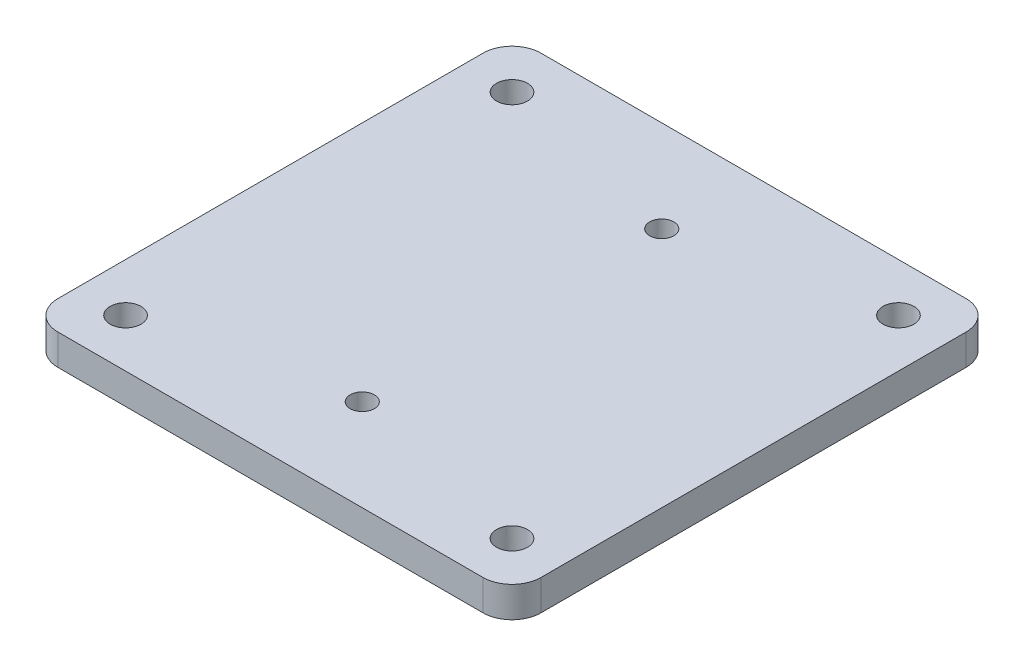
ISO-10303-21;
HEADER;
FILE_DESCRIPTION(('STEP AP214'),'2;1');
FILE_NAME('part.step','',(''),(''),'','','');
FILE_SCHEMA(('AUTOMOTIVE_DESIGN { 1 0 10303 214 1 1 1 1 }'));
ENDSEC;
DATA;
#1=APPLICATION_CONTEXT('core data for automotive mechanical design processes');
#2=APPLICATION_PROTOCOL_DEFINITION('international standard','automotive_design',2000,#1);
#3=PRODUCT_CONTEXT('',#1,'mechanical');
#4=PRODUCT('Part','Part','',(#3));
#5=PRODUCT_RELATED_PRODUCT_CATEGORY('part','',(#4));
#6=PRODUCT_DEFINITION_FORMATION('','',#4);
#7=PRODUCT_DEFINITION_CONTEXT('part definition',#1,'design');
#8=PRODUCT_DEFINITION('design','',#6,#7);
#9=PRODUCT_DEFINITION_SHAPE('','',#8);
#10=(LENGTH_UNIT() NAMED_UNIT(*) SI_UNIT(.MILLI.,.METRE.));
#11=(NAMED_UNIT(*) PLANE_ANGLE_UNIT() SI_UNIT($,.RADIAN.));
#12=(NAMED_UNIT(*) SI_UNIT($,.STERADIAN.) SOLID_ANGLE_UNIT());
#13=UNCERTAINTY_MEASURE_WITH_UNIT(LENGTH_MEASURE(1.E-05),#10,'distance_accuracy_value','');
#14=(GEOMETRIC_REPRESENTATION_CONTEXT(3) GLOBAL_UNCERTAINTY_ASSIGNED_CONTEXT((#13)) GLOBAL_UNIT_ASSIGNED_CONTEXT((#10,
#11,#12)) REPRESENTATION_CONTEXT('',''));
#15=CARTESIAN_POINT('',(0.,0.,0.));
#16=DIRECTION('',(0.,0.,1.));
#17=DIRECTION('',(1.,0.,0.));
#18=AXIS2_PLACEMENT_3D('',#15,#16,#17);
#19=CARTESIAN_POINT('',(0.,0.,0.));
#20=DIRECTION('',(0.,-1.,0.));
#21=DIRECTION('',(0.,0.,-1.));
#22=AXIS2_PLACEMENT_3D('',#19,#20,#21);
#23=PLANE('',#22);
#24=DIRECTION('',(0.,0.,-1.));
#25=VECTOR('',#24,1.);
#26=CARTESIAN_POINT('',(25.,0.,25.));
#27=LINE('',#26,#25);
#28=CARTESIAN_POINT('',(25.,0.,22.));
#29=VERTEX_POINT('',#28);
#30=CARTESIAN_POINT('',(25.,0.,-22.));
#31=VERTEX_POINT('',#30);
#32=EDGE_CURVE('E123',#29,#31,#27,.T.);
#33=ORIENTED_EDGE('',*,*,#32,.F.);
#34=CARTESIAN_POINT('',(22.,0.,22.));
#35=DIRECTION('',(0.,-1.,0.));
#36=DIRECTION('',(0.,0.,-1.));
#37=AXIS2_PLACEMENT_3D('',#34,#35,#36);
#38=CIRCLE('',#37,3.);
#39=CARTESIAN_POINT('',(22.,0.,25.));
#40=VERTEX_POINT('',#39);
#41=EDGE_CURVE('E106',#29,#40,#38,.T.);
#42=ORIENTED_EDGE('',*,*,#41,.T.);
#43=DIRECTION('',(1.,0.,0.));
#44=VECTOR('',#43,1.);
#45=CARTESIAN_POINT('',(-25.,0.,25.));
#46=LINE('',#45,#44);
#47=CARTESIAN_POINT('',(-22.,0.,25.));
#48=VERTEX_POINT('',#47);
#49=EDGE_CURVE('E147',#48,#40,#46,.T.);
#50=ORIENTED_EDGE('',*,*,#49,.F.);
#51=CARTESIAN_POINT('',(-22.,0.,22.));
#52=DIRECTION('',(0.,-1.,0.));
#53=DIRECTION('',(0.,0.,-1.));
#54=AXIS2_PLACEMENT_3D('',#51,#52,#53);
#55=CIRCLE('',#54,3.);
#56=CARTESIAN_POINT('',(-25.,0.,22.));
#57=VERTEX_POINT('',#56);
#58=EDGE_CURVE('E117',#48,#57,#55,.T.);
#59=ORIENTED_EDGE('',*,*,#58,.T.);
#60=DIRECTION('',(0.,0.,1.));
#61=VECTOR('',#60,1.);
#62=CARTESIAN_POINT('',(-25.,0.,25.));
#63=LINE('',#62,#61);
#64=CARTESIAN_POINT('',(-25.,0.,-22.));
#65=VERTEX_POINT('',#64);
#66=EDGE_CURVE('E137',#65,#57,#63,.T.);
#67=ORIENTED_EDGE('',*,*,#66,.F.);
#68=CARTESIAN_POINT('',(-22.,0.,-22.));
#69=DIRECTION('',(0.,-1.,0.));
#70=DIRECTION('',(0.,0.,-1.));
#71=AXIS2_PLACEMENT_3D('',#68,#69,#70);
#72=CIRCLE('',#71,3.);
#73=CARTESIAN_POINT('',(-22.,0.,-25.));
#74=VERTEX_POINT('',#73);
#75=EDGE_CURVE('E127',#65,#74,#72,.T.);
#76=ORIENTED_EDGE('',*,*,#75,.T.);
#77=DIRECTION('',(-1.,0.,0.));
#78=VECTOR('',#77,1.);
#79=CARTESIAN_POINT('',(-25.,0.,-25.));
#80=LINE('',#79,#78);
#81=CARTESIAN_POINT('',(22.,0.,-25.));
#82=VERTEX_POINT('',#81);
#83=EDGE_CURVE('E133',#82,#74,#80,.T.);
#84=ORIENTED_EDGE('',*,*,#83,.F.);
#85=CARTESIAN_POINT('',(22.,0.,-22.));
#86=DIRECTION('',(0.,-1.,0.));
#87=DIRECTION('',(0.,0.,-1.));
#88=AXIS2_PLACEMENT_3D('',#85,#86,#87);
#89=CIRCLE('',#88,3.);
#90=EDGE_CURVE('E132',#82,#31,#89,.T.);
#91=ORIENTED_EDGE('',*,*,#90,.T.);
#92=EDGE_LOOP('',(#33,#42,#50,#59,#67,#76,#84,#91));
#93=FACE_BOUND('',#92,.T.);
#94=CARTESIAN_POINT('',(20.,0.,20.));
#95=DIRECTION('',(0.,-1.,0.));
#96=DIRECTION('',(0.,0.,-1.));
#97=AXIS2_PLACEMENT_3D('',#94,#95,#96);
#98=CIRCLE('',#97,1.6);
#99=CARTESIAN_POINT('',(20.,0.,18.4));
#100=VERTEX_POINT('',#99);
#101=EDGE_CURVE('E134',#100,#100,#98,.T.);
#102=ORIENTED_EDGE('',*,*,#101,.F.);
#103=EDGE_LOOP('',(#102));
#104=FACE_BOUND('',#103,.T.);
#105=CARTESIAN_POINT('',(-20.,0.,20.));
#106=DIRECTION('',(0.,-1.,0.));
#107=DIRECTION('',(0.,0.,-1.));
#108=AXIS2_PLACEMENT_3D('',#105,#106,#107);
#109=CIRCLE('',#108,1.6);
#110=CARTESIAN_POINT('',(-20.,0.,18.4));
#111=VERTEX_POINT('',#110);
#112=EDGE_CURVE('E149',#111,#111,#109,.T.);
#113=ORIENTED_EDGE('',*,*,#112,.F.);
#114=EDGE_LOOP('',(#113));
#115=FACE_BOUND('',#114,.T.);
#116=CARTESIAN_POINT('',(20.,0.,-20.));
#117=DIRECTION('',(0.,-1.,0.));
#118=DIRECTION('',(0.,0.,-1.));
#119=AXIS2_PLACEMENT_3D('',#116,#117,#118);
#120=CIRCLE('',#119,1.6);
#121=CARTESIAN_POINT('',(20.,0.,-21.6));
#122=VERTEX_POINT('',#121);
#123=EDGE_CURVE('E203',#122,#122,#120,.T.);
#124=ORIENTED_EDGE('',*,*,#123,.F.);
#125=EDGE_LOOP('',(#124));
#126=FACE_BOUND('',#125,.T.);
#127=CARTESIAN_POINT('',(-20.,0.,-20.));
#128=DIRECTION('',(0.,-1.,0.));
#129=DIRECTION('',(0.,0.,-1.));
#130=AXIS2_PLACEMENT_3D('',#127,#128,#129);
#131=CIRCLE('',#130,1.6);
#132=CARTESIAN_POINT('',(-20.,0.,-21.6));
#133=VERTEX_POINT('',#132);
#134=EDGE_CURVE('E153',#133,#133,#131,.T.);
#135=ORIENTED_EDGE('',*,*,#134,.F.);
#136=EDGE_LOOP('',(#135));
#137=FACE_BOUND('',#136,.T.);
#138=CARTESIAN_POINT('',(0.,0.,15.5));
#139=DIRECTION('',(0.,1.,0.));
#140=DIRECTION('',(0.,0.,1.));
#141=AXIS2_PLACEMENT_3D('',#138,#139,#140);
#142=CIRCLE('',#141,1.25);
#143=CARTESIAN_POINT('',(0.,0.,16.75));
#144=VERTEX_POINT('',#143);
#145=EDGE_CURVE('E210',#144,#144,#142,.T.);
#146=ORIENTED_EDGE('',*,*,#145,.T.);
#147=EDGE_LOOP('',(#146));
#148=FACE_BOUND('',#147,.T.);
#149=CARTESIAN_POINT('',(0.,0.,-15.5));
#150=DIRECTION('',(0.,1.,0.));
#151=DIRECTION('',(0.,0.,1.));
#152=AXIS2_PLACEMENT_3D('',#149,#150,#151);
#153=CIRCLE('',#152,1.25);
#154=CARTESIAN_POINT('',(0.,0.,-14.25));
#155=VERTEX_POINT('',#154);
#156=EDGE_CURVE('E216',#155,#155,#153,.T.);
#157=ORIENTED_EDGE('',*,*,#156,.T.);
#158=EDGE_LOOP('',(#157));
#159=FACE_BOUND('',#158,.T.);
#160=ADVANCED_FACE('F39',(#93,#104,#115,#126,#137,#148,#159),#23,.T.);
#161=CARTESIAN_POINT('',(25.,3.175,25.));
#162=DIRECTION('',(-1.,0.,0.));
#163=DIRECTION('',(0.,0.,1.));
#164=AXIS2_PLACEMENT_3D('',#161,#162,#163);
#165=PLANE('',#164);
#166=DIRECTION('',(0.,0.,-1.));
#167=VECTOR('',#166,1.);
#168=CARTESIAN_POINT('',(25.,3.175,25.));
#169=LINE('',#168,#167);
#170=CARTESIAN_POINT('',(25.,3.175,22.));
#171=VERTEX_POINT('',#170);
#172=CARTESIAN_POINT('',(25.,3.175,-22.));
#173=VERTEX_POINT('',#172);
#174=EDGE_CURVE('E126',#171,#173,#169,.T.);
#175=ORIENTED_EDGE('',*,*,#174,.F.);
#176=DIRECTION('',(0.,-1.,0.));
#177=VECTOR('',#176,1.);
#178=CARTESIAN_POINT('',(25.,3.175,22.));
#179=LINE('',#178,#177);
#180=EDGE_CURVE('E110',#171,#29,#179,.T.);
#181=ORIENTED_EDGE('',*,*,#180,.T.);
#182=ORIENTED_EDGE('',*,*,#32,.T.);
#183=DIRECTION('',(0.,-1.,0.));
#184=VECTOR('',#183,1.);
#185=CARTESIAN_POINT('',(25.,3.175,-22.));
#186=LINE('',#185,#184);
#187=EDGE_CURVE('E128',#31,#173,#186,.F.);
#188=ORIENTED_EDGE('',*,*,#187,.T.);
#189=EDGE_LOOP('',(#175,#181,#182,#188));
#190=FACE_BOUND('',#189,.T.);
#191=ADVANCED_FACE('F122',(#190),#165,.F.);
#192=CARTESIAN_POINT('',(-25.,3.175,-25.));
#193=DIRECTION('',(0.,0.,1.));
#194=DIRECTION('',(1.,0.,0.));
#195=AXIS2_PLACEMENT_3D('',#192,#193,#194);
#196=PLANE('',#195);
#197=DIRECTION('',(-1.,0.,0.));
#198=VECTOR('',#197,1.);
#199=CARTESIAN_POINT('',(-25.,3.175,-25.));
#200=LINE('',#199,#198);
#201=CARTESIAN_POINT('',(22.,3.175,-25.));
#202=VERTEX_POINT('',#201);
#203=CARTESIAN_POINT('',(-22.,3.175,-25.));
#204=VERTEX_POINT('',#203);
#205=EDGE_CURVE('E179',#202,#204,#200,.T.);
#206=ORIENTED_EDGE('',*,*,#205,.F.);
#207=DIRECTION('',(0.,-1.,0.));
#208=VECTOR('',#207,1.);
#209=CARTESIAN_POINT('',(22.,3.175,-25.));
#210=LINE('',#209,#208);
#211=EDGE_CURVE('E11',#202,#82,#210,.T.);
#212=ORIENTED_EDGE('',*,*,#211,.T.);
#213=ORIENTED_EDGE('',*,*,#83,.T.);
#214=DIRECTION('',(0.,-1.,0.));
#215=VECTOR('',#214,1.);
#216=CARTESIAN_POINT('',(-22.,3.175,-25.));
#217=LINE('',#216,#215);
#218=EDGE_CURVE('E47',#74,#204,#217,.F.);
#219=ORIENTED_EDGE('',*,*,#218,.T.);
#220=EDGE_LOOP('',(#206,#212,#213,#219));
#221=FACE_BOUND('',#220,.T.);
#222=ADVANCED_FACE('F178',(#221),#196,.F.);
#223=CARTESIAN_POINT('',(-25.,3.175,25.));
#224=DIRECTION('',(1.,0.,0.));
#225=DIRECTION('',(0.,0.,-1.));
#226=AXIS2_PLACEMENT_3D('',#223,#224,#225);
#227=PLANE('',#226);
#228=ORIENTED_EDGE('',*,*,#66,.T.);
#229=DIRECTION('',(0.,-1.,0.));
#230=VECTOR('',#229,1.);
#231=CARTESIAN_POINT('',(-25.,3.175,22.));
#232=LINE('',#231,#230);
#233=CARTESIAN_POINT('',(-25.,3.175,22.));
#234=VERTEX_POINT('',#233);
#235=EDGE_CURVE('E54',#57,#234,#232,.F.);
#236=ORIENTED_EDGE('',*,*,#235,.T.);
#237=DIRECTION('',(0.,0.,1.));
#238=VECTOR('',#237,1.);
#239=CARTESIAN_POINT('',(-25.,3.175,25.));
#240=LINE('',#239,#238);
#241=CARTESIAN_POINT('',(-25.,3.175,-22.));
#242=VERTEX_POINT('',#241);
#243=EDGE_CURVE('E185',#242,#234,#240,.T.);
#244=ORIENTED_EDGE('',*,*,#243,.F.);
#245=DIRECTION('',(0.,-1.,0.));
#246=VECTOR('',#245,1.);
#247=CARTESIAN_POINT('',(-25.,3.175,-22.));
#248=LINE('',#247,#246);
#249=EDGE_CURVE('E172',#242,#65,#248,.T.);
#250=ORIENTED_EDGE('',*,*,#249,.T.);
#251=EDGE_LOOP('',(#228,#236,#244,#250));
#252=FACE_BOUND('',#251,.T.);
#253=ADVANCED_FACE('F189',(#252),#227,.F.);
#254=CARTESIAN_POINT('',(-25.,3.175,25.));
#255=DIRECTION('',(0.,0.,-1.));
#256=DIRECTION('',(-1.,0.,0.));
#257=AXIS2_PLACEMENT_3D('',#254,#255,#256);
#258=PLANE('',#257);
#259=ORIENTED_EDGE('',*,*,#49,.T.);
#260=DIRECTION('',(0.,-1.,0.));
#261=VECTOR('',#260,1.);
#262=CARTESIAN_POINT('',(22.,3.175,25.));
#263=LINE('',#262,#261);
#264=CARTESIAN_POINT('',(22.,3.175,25.));
#265=VERTEX_POINT('',#264);
#266=EDGE_CURVE('E111',#40,#265,#263,.F.);
#267=ORIENTED_EDGE('',*,*,#266,.T.);
#268=DIRECTION('',(1.,0.,0.));
#269=VECTOR('',#268,1.);
#270=CARTESIAN_POINT('',(-25.,3.175,25.));
#271=LINE('',#270,#269);
#272=CARTESIAN_POINT('',(-22.,3.175,25.));
#273=VERTEX_POINT('',#272);
#274=EDGE_CURVE('E143',#273,#265,#271,.T.);
#275=ORIENTED_EDGE('',*,*,#274,.F.);
#276=DIRECTION('',(0.,-1.,0.));
#277=VECTOR('',#276,1.);
#278=CARTESIAN_POINT('',(-22.,3.175,25.));
#279=LINE('',#278,#277);
#280=EDGE_CURVE('E116',#273,#48,#279,.T.);
#281=ORIENTED_EDGE('',*,*,#280,.T.);
#282=EDGE_LOOP('',(#259,#267,#275,#281));
#283=FACE_BOUND('',#282,.T.);
#284=ADVANCED_FACE('F196',(#283),#258,.F.);
#285=CARTESIAN_POINT('',(0.,3.175,0.));
#286=DIRECTION('',(0.,-1.,0.));
#287=DIRECTION('',(0.,0.,-1.));
#288=AXIS2_PLACEMENT_3D('',#285,#286,#287);
#289=PLANE('',#288);
#290=CARTESIAN_POINT('',(0.,3.175,-15.5));
#291=DIRECTION('',(0.,1.,0.));
#292=DIRECTION('',(0.,0.,1.));
#293=AXIS2_PLACEMENT_3D('',#290,#291,#292);
#294=CIRCLE('',#293,1.24999999999999);
#295=CARTESIAN_POINT('',(0.,3.175,-14.25));
#296=VERTEX_POINT('',#295);
#297=EDGE_CURVE('E219',#296,#296,#294,.T.);
#298=ORIENTED_EDGE('',*,*,#297,.F.);
#299=EDGE_LOOP('',(#298));
#300=FACE_BOUND('',#299,.T.);
#301=CARTESIAN_POINT('',(0.,3.175,15.5));
#302=DIRECTION('',(0.,1.,0.));
#303=DIRECTION('',(0.,0.,1.));
#304=AXIS2_PLACEMENT_3D('',#301,#302,#303);
#305=CIRCLE('',#304,1.24999999999999);
#306=CARTESIAN_POINT('',(0.,3.175,16.75));
#307=VERTEX_POINT('',#306);
#308=EDGE_CURVE('E213',#307,#307,#305,.T.);
#309=ORIENTED_EDGE('',*,*,#308,.F.);
#310=EDGE_LOOP('',(#309));
#311=FACE_BOUND('',#310,.T.);
#312=CARTESIAN_POINT('',(-20.,3.175,-20.));
#313=DIRECTION('',(0.,1.,0.));
#314=DIRECTION('',(0.,0.,1.));
#315=AXIS2_PLACEMENT_3D('',#312,#313,#314);
#316=CIRCLE('',#315,1.6);
#317=CARTESIAN_POINT('',(-20.,3.175,-18.4));
#318=VERTEX_POINT('',#317);
#319=EDGE_CURVE('E157',#318,#318,#316,.T.);
#320=ORIENTED_EDGE('',*,*,#319,.F.);
#321=EDGE_LOOP('',(#320));
#322=FACE_BOUND('',#321,.T.);
#323=CARTESIAN_POINT('',(20.,3.175,-20.));
#324=DIRECTION('',(0.,1.,0.));
#325=DIRECTION('',(0.,0.,1.));
#326=AXIS2_PLACEMENT_3D('',#323,#324,#325);
#327=CIRCLE('',#326,1.6);
#328=CARTESIAN_POINT('',(20.,3.175,-18.4));
#329=VERTEX_POINT('',#328);
#330=EDGE_CURVE('E156',#329,#329,#327,.T.);
#331=ORIENTED_EDGE('',*,*,#330,.F.);
#332=EDGE_LOOP('',(#331));
#333=FACE_BOUND('',#332,.T.);
#334=CARTESIAN_POINT('',(-20.,3.175,20.));
#335=DIRECTION('',(0.,1.,0.));
#336=DIRECTION('',(0.,0.,1.));
#337=AXIS2_PLACEMENT_3D('',#334,#335,#336);
#338=CIRCLE('',#337,1.6);
#339=CARTESIAN_POINT('',(-20.,3.175,21.6));
#340=VERTEX_POINT('',#339);
#341=EDGE_CURVE('E152',#340,#340,#338,.T.);
#342=ORIENTED_EDGE('',*,*,#341,.F.);
#343=EDGE_LOOP('',(#342));
#344=FACE_BOUND('',#343,.T.);
#345=CARTESIAN_POINT('',(20.,3.175,20.));
#346=DIRECTION('',(0.,1.,0.));
#347=DIRECTION('',(0.,0.,1.));
#348=AXIS2_PLACEMENT_3D('',#345,#346,#347);
#349=CIRCLE('',#348,1.6);
#350=CARTESIAN_POINT('',(20.,3.175,21.6));
#351=VERTEX_POINT('',#350);
#352=EDGE_CURVE('E140',#351,#351,#349,.T.);
#353=ORIENTED_EDGE('',*,*,#352,.F.);
#354=EDGE_LOOP('',(#353));
#355=FACE_BOUND('',#354,.T.);
#356=ORIENTED_EDGE('',*,*,#274,.T.);
#357=CARTESIAN_POINT('',(22.,3.175,22.));
#358=DIRECTION('',(0.,-1.,0.));
#359=DIRECTION('',(0.,0.,-1.));
#360=AXIS2_PLACEMENT_3D('',#357,#358,#359);
#361=CIRCLE('',#360,3.);
#362=EDGE_CURVE('E170',#265,#171,#361,.F.);
#363=ORIENTED_EDGE('',*,*,#362,.T.);
#364=ORIENTED_EDGE('',*,*,#174,.T.);
#365=CARTESIAN_POINT('',(22.,3.175,-22.));
#366=DIRECTION('',(0.,-1.,0.));
#367=DIRECTION('',(0.,0.,-1.));
#368=AXIS2_PLACEMENT_3D('',#365,#366,#367);
#369=CIRCLE('',#368,3.);
#370=EDGE_CURVE('E166',#173,#202,#369,.F.);
#371=ORIENTED_EDGE('',*,*,#370,.T.);
#372=ORIENTED_EDGE('',*,*,#205,.T.);
#373=CARTESIAN_POINT('',(-22.,3.175,-22.));
#374=DIRECTION('',(0.,-1.,0.));
#375=DIRECTION('',(0.,0.,-1.));
#376=AXIS2_PLACEMENT_3D('',#373,#374,#375);
#377=CIRCLE('',#376,3.);
#378=EDGE_CURVE('E61',#204,#242,#377,.F.);
#379=ORIENTED_EDGE('',*,*,#378,.T.);
#380=ORIENTED_EDGE('',*,*,#243,.T.);
#381=CARTESIAN_POINT('',(-22.,3.175,22.));
#382=DIRECTION('',(0.,-1.,0.));
#383=DIRECTION('',(0.,0.,-1.));
#384=AXIS2_PLACEMENT_3D('',#381,#382,#383);
#385=CIRCLE('',#384,3.);
#386=EDGE_CURVE('E168',#234,#273,#385,.F.);
#387=ORIENTED_EDGE('',*,*,#386,.T.);
#388=EDGE_LOOP('',(#356,#363,#364,#371,#372,#379,#380,#387));
#389=FACE_BOUND('',#388,.T.);
#390=ADVANCED_FACE('F183',(#300,#311,#322,#333,#344,#355,#389),#289,.F.);
#391=CARTESIAN_POINT('',(20.,3.175,20.));
#392=DIRECTION('',(0.,1.,0.));
#393=DIRECTION('',(0.,0.,1.));
#394=AXIS2_PLACEMENT_3D('',#391,#392,#393);
#395=CYLINDRICAL_SURFACE('',#394,1.6);
#396=ORIENTED_EDGE('',*,*,#101,.T.);
#397=EDGE_LOOP('',(#396));
#398=FACE_BOUND('',#397,.T.);
#399=ORIENTED_EDGE('',*,*,#352,.T.);
#400=EDGE_LOOP('',(#399));
#401=FACE_BOUND('',#400,.T.);
#402=ADVANCED_FACE('F227',(#398,#401),#395,.F.);
#403=CARTESIAN_POINT('',(-20.,3.175,20.));
#404=DIRECTION('',(0.,1.,0.));
#405=DIRECTION('',(0.,0.,1.));
#406=AXIS2_PLACEMENT_3D('',#403,#404,#405);
#407=CYLINDRICAL_SURFACE('',#406,1.6);
#408=ORIENTED_EDGE('',*,*,#112,.T.);
#409=EDGE_LOOP('',(#408));
#410=FACE_BOUND('',#409,.T.);
#411=ORIENTED_EDGE('',*,*,#341,.T.);
#412=EDGE_LOOP('',(#411));
#413=FACE_BOUND('',#412,.T.);
#414=ADVANCED_FACE('F240',(#410,#413),#407,.F.);
#415=CARTESIAN_POINT('',(20.,3.175,-20.));
#416=DIRECTION('',(0.,1.,0.));
#417=DIRECTION('',(0.,0.,1.));
#418=AXIS2_PLACEMENT_3D('',#415,#416,#417);
#419=CYLINDRICAL_SURFACE('',#418,1.6);
#420=ORIENTED_EDGE('',*,*,#123,.T.);
#421=EDGE_LOOP('',(#420));
#422=FACE_BOUND('',#421,.T.);
#423=ORIENTED_EDGE('',*,*,#330,.T.);
#424=EDGE_LOOP('',(#423));
#425=FACE_BOUND('',#424,.T.);
#426=ADVANCED_FACE('F246',(#422,#425),#419,.F.);
#427=CARTESIAN_POINT('',(-20.,3.175,-20.));
#428=DIRECTION('',(0.,1.,0.));
#429=DIRECTION('',(0.,0.,1.));
#430=AXIS2_PLACEMENT_3D('',#427,#428,#429);
#431=CYLINDRICAL_SURFACE('',#430,1.6);
#432=ORIENTED_EDGE('',*,*,#134,.T.);
#433=EDGE_LOOP('',(#432));
#434=FACE_BOUND('',#433,.T.);
#435=ORIENTED_EDGE('',*,*,#319,.T.);
#436=EDGE_LOOP('',(#435));
#437=FACE_BOUND('',#436,.T.);
#438=ADVANCED_FACE('F309',(#434,#437),#431,.F.);
#439=CARTESIAN_POINT('',(0.,3.175,15.5));
#440=DIRECTION('',(0.,1.,0.));
#441=DIRECTION('',(0.,0.,1.));
#442=AXIS2_PLACEMENT_3D('',#439,#440,#441);
#443=CYLINDRICAL_SURFACE('',#442,1.24999999999999);
#444=ORIENTED_EDGE('',*,*,#145,.F.);
#445=EDGE_LOOP('',(#444));
#446=FACE_BOUND('',#445,.T.);
#447=ORIENTED_EDGE('',*,*,#308,.T.);
#448=EDGE_LOOP('',(#447));
#449=FACE_BOUND('',#448,.T.);
#450=ADVANCED_FACE('F299',(#446,#449),#443,.F.);
#451=CARTESIAN_POINT('',(0.,3.175,-15.5));
#452=DIRECTION('',(0.,1.,0.));
#453=DIRECTION('',(0.,0.,1.));
#454=AXIS2_PLACEMENT_3D('',#451,#452,#453);
#455=CYLINDRICAL_SURFACE('',#454,1.24999999999999);
#456=ORIENTED_EDGE('',*,*,#156,.F.);
#457=EDGE_LOOP('',(#456));
#458=FACE_BOUND('',#457,.T.);
#459=ORIENTED_EDGE('',*,*,#297,.T.);
#460=EDGE_LOOP('',(#459));
#461=FACE_BOUND('',#460,.T.);
#462=ADVANCED_FACE('F223',(#458,#461),#455,.F.);
#463=CARTESIAN_POINT('',(22.,3.175,22.));
#464=DIRECTION('',(0.,-1.,0.));
#465=DIRECTION('',(0.,0.,-1.));
#466=AXIS2_PLACEMENT_3D('',#463,#464,#465);
#467=CYLINDRICAL_SURFACE('',#466,3.);
#468=ORIENTED_EDGE('',*,*,#362,.F.);
#469=ORIENTED_EDGE('',*,*,#266,.F.);
#470=ORIENTED_EDGE('',*,*,#41,.F.);
#471=ORIENTED_EDGE('',*,*,#180,.F.);
#472=EDGE_LOOP('',(#468,#469,#470,#471));
#473=FACE_BOUND('',#472,.T.);
#474=ADVANCED_FACE('F109',(#473),#467,.T.);
#475=CARTESIAN_POINT('',(-22.,3.175,22.));
#476=DIRECTION('',(0.,-1.,0.));
#477=DIRECTION('',(0.,0.,-1.));
#478=AXIS2_PLACEMENT_3D('',#475,#476,#477);
#479=CYLINDRICAL_SURFACE('',#478,3.);
#480=ORIENTED_EDGE('',*,*,#386,.F.);
#481=ORIENTED_EDGE('',*,*,#235,.F.);
#482=ORIENTED_EDGE('',*,*,#58,.F.);
#483=ORIENTED_EDGE('',*,*,#280,.F.);
#484=EDGE_LOOP('',(#480,#481,#482,#483));
#485=FACE_BOUND('',#484,.T.);
#486=ADVANCED_FACE('F193',(#485),#479,.T.);
#487=CARTESIAN_POINT('',(22.,3.175,-22.));
#488=DIRECTION('',(0.,-1.,0.));
#489=DIRECTION('',(0.,0.,-1.));
#490=AXIS2_PLACEMENT_3D('',#487,#488,#489);
#491=CYLINDRICAL_SURFACE('',#490,3.);
#492=ORIENTED_EDGE('',*,*,#370,.F.);
#493=ORIENTED_EDGE('',*,*,#187,.F.);
#494=ORIENTED_EDGE('',*,*,#90,.F.);
#495=ORIENTED_EDGE('',*,*,#211,.F.);
#496=EDGE_LOOP('',(#492,#493,#494,#495));
#497=FACE_BOUND('',#496,.T.);
#498=ADVANCED_FACE('F266',(#497),#491,.T.);
#499=CARTESIAN_POINT('',(-22.,3.175,-22.));
#500=DIRECTION('',(0.,-1.,0.));
#501=DIRECTION('',(0.,0.,-1.));
#502=AXIS2_PLACEMENT_3D('',#499,#500,#501);
#503=CYLINDRICAL_SURFACE('',#502,3.);
#504=ORIENTED_EDGE('',*,*,#378,.F.);
#505=ORIENTED_EDGE('',*,*,#218,.F.);
#506=ORIENTED_EDGE('',*,*,#75,.F.);
#507=ORIENTED_EDGE('',*,*,#249,.F.);
#508=EDGE_LOOP('',(#504,#505,#506,#507));
#509=FACE_BOUND('',#508,.T.);
#510=ADVANCED_FACE('F41',(#509),#503,.T.);
#511=CLOSED_SHELL('',(#160,#191,#222,#253,#284,#390,#402,#414,#426,#438,#450,#462,#474,#486,
#498,#510));
#512=MANIFOLD_SOLID_BREP('B2',#511);
#513=ADVANCED_BREP_SHAPE_REPRESENTATION('',(#18,#512),#14);
#514=SHAPE_DEFINITION_REPRESENTATION(#9,#513);
ENDSEC;
END-ISO-10303-21;
